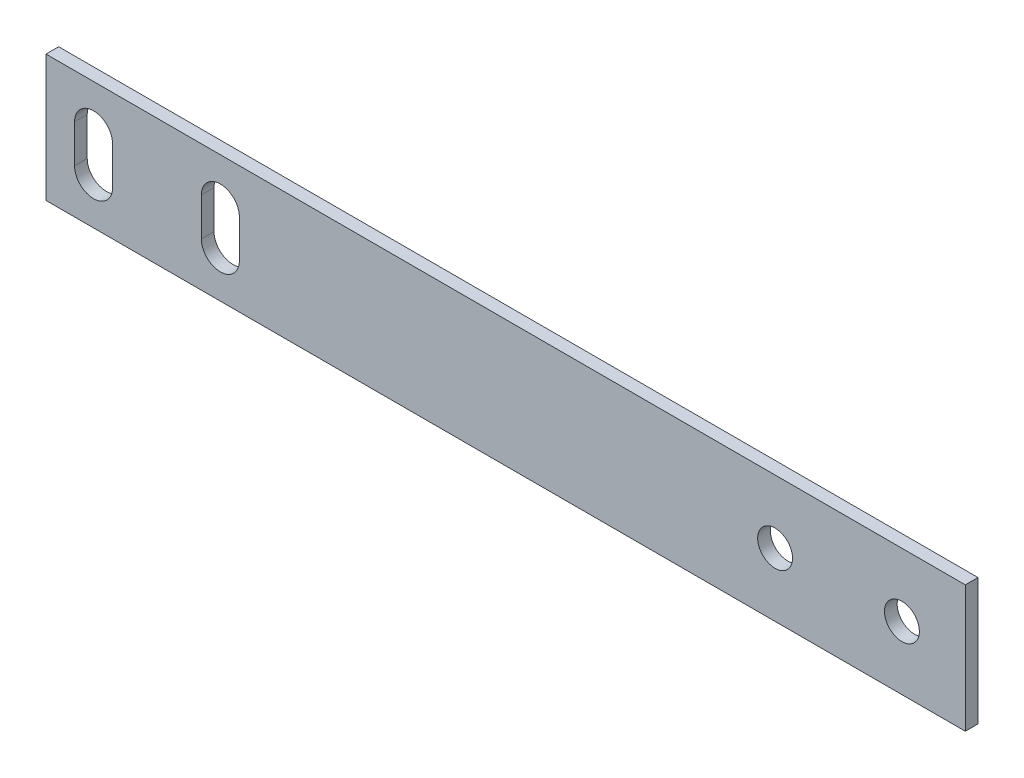
ISO-10303-21;
HEADER;
FILE_DESCRIPTION(('STEP AP214'),'2;1');
FILE_NAME('part.step','',(''),(''),'','','');
FILE_SCHEMA(('AUTOMOTIVE_DESIGN { 1 0 10303 214 1 1 1 1 }'));
ENDSEC;
DATA;
#1=APPLICATION_CONTEXT('core data for automotive mechanical design processes');
#2=APPLICATION_PROTOCOL_DEFINITION('international standard','automotive_design',2000,#1);
#3=PRODUCT_CONTEXT('',#1,'mechanical');
#4=PRODUCT('Part','Part','',(#3));
#5=PRODUCT_RELATED_PRODUCT_CATEGORY('part','',(#4));
#6=PRODUCT_DEFINITION_FORMATION('','',#4);
#7=PRODUCT_DEFINITION_CONTEXT('part definition',#1,'design');
#8=PRODUCT_DEFINITION('design','',#6,#7);
#9=PRODUCT_DEFINITION_SHAPE('','',#8);
#10=(LENGTH_UNIT() NAMED_UNIT(*) SI_UNIT(.MILLI.,.METRE.));
#11=(NAMED_UNIT(*) PLANE_ANGLE_UNIT() SI_UNIT($,.RADIAN.));
#12=(NAMED_UNIT(*) SI_UNIT($,.STERADIAN.) SOLID_ANGLE_UNIT());
#13=UNCERTAINTY_MEASURE_WITH_UNIT(LENGTH_MEASURE(1.E-05),#10,'distance_accuracy_value','');
#14=(GEOMETRIC_REPRESENTATION_CONTEXT(3) GLOBAL_UNCERTAINTY_ASSIGNED_CONTEXT((#13)) GLOBAL_UNIT_ASSIGNED_CONTEXT((#10,
#11,#12)) REPRESENTATION_CONTEXT('',''));
#15=CARTESIAN_POINT('',(0.,0.,0.));
#16=DIRECTION('',(0.,0.,1.));
#17=DIRECTION('',(1.,0.,0.));
#18=AXIS2_PLACEMENT_3D('',#15,#16,#17);
#19=CARTESIAN_POINT('',(0.,0.,2.));
#20=DIRECTION('',(0.,0.,-1.));
#21=DIRECTION('',(-1.,0.,0.));
#22=AXIS2_PLACEMENT_3D('',#19,#20,#21);
#23=PLANE('',#22);
#24=CARTESIAN_POINT('',(-65.,-3.,2.));
#25=DIRECTION('',(0.,0.,1.));
#26=DIRECTION('',(1.,0.,0.));
#27=AXIS2_PLACEMENT_3D('',#24,#25,#26);
#28=CIRCLE('',#27,3.);
#29=CARTESIAN_POINT('',(-68.,-3.,2.));
#30=VERTEX_POINT('',#29);
#31=CARTESIAN_POINT('',(-62.,-3.,2.));
#32=VERTEX_POINT('',#31);
#33=EDGE_CURVE('E177',#30,#32,#28,.T.);
#34=ORIENTED_EDGE('',*,*,#33,.F.);
#35=DIRECTION('',(0.,-1.,0.));
#36=VECTOR('',#35,1.);
#37=CARTESIAN_POINT('',(-68.,-3.,2.));
#38=LINE('',#37,#36);
#39=CARTESIAN_POINT('',(-68.,3.,2.));
#40=VERTEX_POINT('',#39);
#41=EDGE_CURVE('E188',#40,#30,#38,.T.);
#42=ORIENTED_EDGE('',*,*,#41,.F.);
#43=CARTESIAN_POINT('',(-65.,3.,2.));
#44=DIRECTION('',(0.,0.,1.));
#45=DIRECTION('',(1.,0.,0.));
#46=AXIS2_PLACEMENT_3D('',#43,#44,#45);
#47=CIRCLE('',#46,3.);
#48=CARTESIAN_POINT('',(-62.,3.,2.));
#49=VERTEX_POINT('',#48);
#50=EDGE_CURVE('E184',#49,#40,#47,.T.);
#51=ORIENTED_EDGE('',*,*,#50,.F.);
#52=DIRECTION('',(0.,1.,0.));
#53=VECTOR('',#52,1.);
#54=CARTESIAN_POINT('',(-62.,-3.,2.));
#55=LINE('',#54,#53);
#56=EDGE_CURVE('E180',#32,#49,#55,.T.);
#57=ORIENTED_EDGE('',*,*,#56,.F.);
#58=EDGE_LOOP('',(#34,#42,#51,#57));
#59=FACE_BOUND('',#58,.T.);
#60=DIRECTION('',(0.,-1.,0.));
#61=VECTOR('',#60,1.);
#62=CARTESIAN_POINT('',(-72.5,9.99999999999999,2.));
#63=LINE('',#62,#61);
#64=CARTESIAN_POINT('',(-72.5,9.99999999999999,2.));
#65=VERTEX_POINT('',#64);
#66=CARTESIAN_POINT('',(-72.5,-10.,2.));
#67=VERTEX_POINT('',#66);
#68=EDGE_CURVE('E236',#65,#67,#63,.T.);
#69=ORIENTED_EDGE('',*,*,#68,.T.);
#70=DIRECTION('',(1.,0.,0.));
#71=VECTOR('',#70,1.);
#72=CARTESIAN_POINT('',(72.5,-9.99999999999999,2.));
#73=LINE('',#72,#71);
#74=CARTESIAN_POINT('',(72.5,-9.99999999999999,2.));
#75=VERTEX_POINT('',#74);
#76=EDGE_CURVE('E240',#67,#75,#73,.T.);
#77=ORIENTED_EDGE('',*,*,#76,.T.);
#78=DIRECTION('',(0.,1.,0.));
#79=VECTOR('',#78,1.);
#80=CARTESIAN_POINT('',(72.5,10.,2.));
#81=LINE('',#80,#79);
#82=CARTESIAN_POINT('',(72.5,10.,2.));
#83=VERTEX_POINT('',#82);
#84=EDGE_CURVE('E244',#75,#83,#81,.T.);
#85=ORIENTED_EDGE('',*,*,#84,.T.);
#86=DIRECTION('',(-1.,0.,0.));
#87=VECTOR('',#86,1.);
#88=CARTESIAN_POINT('',(72.5,10.,2.));
#89=LINE('',#88,#87);
#90=EDGE_CURVE('E247',#83,#65,#89,.T.);
#91=ORIENTED_EDGE('',*,*,#90,.T.);
#92=EDGE_LOOP('',(#69,#77,#85,#91));
#93=FACE_BOUND('',#92,.T.);
#94=CARTESIAN_POINT('',(62.5,0.,2.));
#95=DIRECTION('',(0.,0.,1.));
#96=DIRECTION('',(1.,0.,0.));
#97=AXIS2_PLACEMENT_3D('',#94,#95,#96);
#98=CIRCLE('',#97,2.75000000000001);
#99=CARTESIAN_POINT('',(65.25,0.,2.));
#100=VERTEX_POINT('',#99);
#101=EDGE_CURVE('E228',#100,#100,#98,.T.);
#102=ORIENTED_EDGE('',*,*,#101,.F.);
#103=EDGE_LOOP('',(#102));
#104=FACE_BOUND('',#103,.T.);
#105=CARTESIAN_POINT('',(42.5,0.,2.));
#106=DIRECTION('',(0.,0.,1.));
#107=DIRECTION('',(1.,0.,0.));
#108=AXIS2_PLACEMENT_3D('',#105,#106,#107);
#109=CIRCLE('',#108,2.75);
#110=CARTESIAN_POINT('',(45.25,0.,2.));
#111=VERTEX_POINT('',#110);
#112=EDGE_CURVE('E220',#111,#111,#109,.T.);
#113=ORIENTED_EDGE('',*,*,#112,.F.);
#114=EDGE_LOOP('',(#113));
#115=FACE_BOUND('',#114,.T.);
#116=CARTESIAN_POINT('',(-45.,-3.,2.));
#117=DIRECTION('',(0.,0.,1.));
#118=DIRECTION('',(1.,0.,0.));
#119=AXIS2_PLACEMENT_3D('',#116,#117,#118);
#120=CIRCLE('',#119,3.);
#121=CARTESIAN_POINT('',(-48.,-3.,2.));
#122=VERTEX_POINT('',#121);
#123=CARTESIAN_POINT('',(-42.,-3.,2.));
#124=VERTEX_POINT('',#123);
#125=EDGE_CURVE('E129',#122,#124,#120,.T.);
#126=ORIENTED_EDGE('',*,*,#125,.F.);
#127=DIRECTION('',(0.,-1.,0.));
#128=VECTOR('',#127,1.);
#129=CARTESIAN_POINT('',(-48.,-3.,2.));
#130=LINE('',#129,#128);
#131=CARTESIAN_POINT('',(-48.,3.,2.));
#132=VERTEX_POINT('',#131);
#133=EDGE_CURVE('E155',#132,#122,#130,.T.);
#134=ORIENTED_EDGE('',*,*,#133,.F.);
#135=CARTESIAN_POINT('',(-45.,3.,2.));
#136=DIRECTION('',(0.,0.,1.));
#137=DIRECTION('',(1.,0.,0.));
#138=AXIS2_PLACEMENT_3D('',#135,#136,#137);
#139=CIRCLE('',#138,3.);
#140=CARTESIAN_POINT('',(-42.,3.,2.));
#141=VERTEX_POINT('',#140);
#142=EDGE_CURVE('E151',#141,#132,#139,.T.);
#143=ORIENTED_EDGE('',*,*,#142,.F.);
#144=DIRECTION('',(0.,1.,0.));
#145=VECTOR('',#144,1.);
#146=CARTESIAN_POINT('',(-42.,-3.,2.));
#147=LINE('',#146,#145);
#148=EDGE_CURVE('E138',#124,#141,#147,.T.);
#149=ORIENTED_EDGE('',*,*,#148,.F.);
#150=EDGE_LOOP('',(#126,#134,#143,#149));
#151=FACE_BOUND('',#150,.T.);
#152=ADVANCED_FACE('F39',(#59,#93,#104,#115,#151),#23,.F.);
#153=CARTESIAN_POINT('',(0.,0.,0.));
#154=DIRECTION('',(0.,0.,-1.));
#155=DIRECTION('',(-1.,0.,0.));
#156=AXIS2_PLACEMENT_3D('',#153,#154,#155);
#157=PLANE('',#156);
#158=CARTESIAN_POINT('',(62.5,0.,0.));
#159=DIRECTION('',(0.,0.,1.));
#160=DIRECTION('',(1.,0.,0.));
#161=AXIS2_PLACEMENT_3D('',#158,#159,#160);
#162=CIRCLE('',#161,2.75000000000001);
#163=CARTESIAN_POINT('',(65.25,0.,0.));
#164=VERTEX_POINT('',#163);
#165=EDGE_CURVE('E224',#164,#164,#162,.T.);
#166=ORIENTED_EDGE('',*,*,#165,.T.);
#167=EDGE_LOOP('',(#166));
#168=FACE_BOUND('',#167,.T.);
#169=DIRECTION('',(0.,-1.,0.));
#170=VECTOR('',#169,1.);
#171=CARTESIAN_POINT('',(-72.5,9.99999999999999,0.));
#172=LINE('',#171,#170);
#173=CARTESIAN_POINT('',(-72.5,9.99999999999999,0.));
#174=VERTEX_POINT('',#173);
#175=CARTESIAN_POINT('',(-72.5,-10.,0.));
#176=VERTEX_POINT('',#175);
#177=EDGE_CURVE('E232',#174,#176,#172,.T.);
#178=ORIENTED_EDGE('',*,*,#177,.F.);
#179=DIRECTION('',(-1.,0.,0.));
#180=VECTOR('',#179,1.);
#181=CARTESIAN_POINT('',(72.5,10.,0.));
#182=LINE('',#181,#180);
#183=CARTESIAN_POINT('',(72.5,10.,0.));
#184=VERTEX_POINT('',#183);
#185=EDGE_CURVE('E241',#184,#174,#182,.T.);
#186=ORIENTED_EDGE('',*,*,#185,.F.);
#187=DIRECTION('',(0.,1.,0.));
#188=VECTOR('',#187,1.);
#189=CARTESIAN_POINT('',(72.5,10.,0.));
#190=LINE('',#189,#188);
#191=CARTESIAN_POINT('',(72.5,-9.99999999999999,0.));
#192=VERTEX_POINT('',#191);
#193=EDGE_CURVE('E257',#192,#184,#190,.T.);
#194=ORIENTED_EDGE('',*,*,#193,.F.);
#195=DIRECTION('',(1.,0.,0.));
#196=VECTOR('',#195,1.);
#197=CARTESIAN_POINT('',(72.5,-9.99999999999999,0.));
#198=LINE('',#197,#196);
#199=EDGE_CURVE('E254',#176,#192,#198,.T.);
#200=ORIENTED_EDGE('',*,*,#199,.F.);
#201=EDGE_LOOP('',(#178,#186,#194,#200));
#202=FACE_BOUND('',#201,.T.);
#203=CARTESIAN_POINT('',(42.5,0.,0.));
#204=DIRECTION('',(0.,0.,1.));
#205=DIRECTION('',(1.,0.,0.));
#206=AXIS2_PLACEMENT_3D('',#203,#204,#205);
#207=CIRCLE('',#206,2.75);
#208=CARTESIAN_POINT('',(45.25,0.,0.));
#209=VERTEX_POINT('',#208);
#210=EDGE_CURVE('E219',#209,#209,#207,.T.);
#211=ORIENTED_EDGE('',*,*,#210,.T.);
#212=EDGE_LOOP('',(#211));
#213=FACE_BOUND('',#212,.T.);
#214=DIRECTION('',(0.,-1.,0.));
#215=VECTOR('',#214,1.);
#216=CARTESIAN_POINT('',(-68.,-3.,0.));
#217=LINE('',#216,#215);
#218=CARTESIAN_POINT('',(-68.,3.,0.));
#219=VERTEX_POINT('',#218);
#220=CARTESIAN_POINT('',(-68.,-3.,0.));
#221=VERTEX_POINT('',#220);
#222=EDGE_CURVE('E181',#219,#221,#217,.T.);
#223=ORIENTED_EDGE('',*,*,#222,.T.);
#224=CARTESIAN_POINT('',(-65.,-3.,0.));
#225=DIRECTION('',(0.,0.,1.));
#226=DIRECTION('',(1.,0.,0.));
#227=AXIS2_PLACEMENT_3D('',#224,#225,#226);
#228=CIRCLE('',#227,3.);
#229=CARTESIAN_POINT('',(-62.,-3.,0.));
#230=VERTEX_POINT('',#229);
#231=EDGE_CURVE('E147',#221,#230,#228,.T.);
#232=ORIENTED_EDGE('',*,*,#231,.T.);
#233=DIRECTION('',(0.,1.,0.));
#234=VECTOR('',#233,1.);
#235=CARTESIAN_POINT('',(-62.,-3.,0.));
#236=LINE('',#235,#234);
#237=CARTESIAN_POINT('',(-62.,3.,0.));
#238=VERTEX_POINT('',#237);
#239=EDGE_CURVE('E195',#230,#238,#236,.T.);
#240=ORIENTED_EDGE('',*,*,#239,.T.);
#241=CARTESIAN_POINT('',(-65.,3.,0.));
#242=DIRECTION('',(0.,0.,1.));
#243=DIRECTION('',(1.,0.,0.));
#244=AXIS2_PLACEMENT_3D('',#241,#242,#243);
#245=CIRCLE('',#244,3.);
#246=EDGE_CURVE('E199',#238,#219,#245,.T.);
#247=ORIENTED_EDGE('',*,*,#246,.T.);
#248=EDGE_LOOP('',(#223,#232,#240,#247));
#249=FACE_BOUND('',#248,.T.);
#250=DIRECTION('',(0.,-1.,0.));
#251=VECTOR('',#250,1.);
#252=CARTESIAN_POINT('',(-48.,-3.,0.));
#253=LINE('',#252,#251);
#254=CARTESIAN_POINT('',(-48.,3.,0.));
#255=VERTEX_POINT('',#254);
#256=CARTESIAN_POINT('',(-48.,-3.,0.));
#257=VERTEX_POINT('',#256);
#258=EDGE_CURVE('E139',#255,#257,#253,.T.);
#259=ORIENTED_EDGE('',*,*,#258,.T.);
#260=CARTESIAN_POINT('',(-45.,-3.,0.));
#261=DIRECTION('',(0.,0.,1.));
#262=DIRECTION('',(1.,0.,0.));
#263=AXIS2_PLACEMENT_3D('',#260,#261,#262);
#264=CIRCLE('',#263,3.);
#265=CARTESIAN_POINT('',(-42.,-3.,0.));
#266=VERTEX_POINT('',#265);
#267=EDGE_CURVE('E63',#257,#266,#264,.T.);
#268=ORIENTED_EDGE('',*,*,#267,.T.);
#269=DIRECTION('',(0.,1.,0.));
#270=VECTOR('',#269,1.);
#271=CARTESIAN_POINT('',(-42.,-3.,0.));
#272=LINE('',#271,#270);
#273=CARTESIAN_POINT('',(-42.,3.,0.));
#274=VERTEX_POINT('',#273);
#275=EDGE_CURVE('E145',#266,#274,#272,.T.);
#276=ORIENTED_EDGE('',*,*,#275,.T.);
#277=CARTESIAN_POINT('',(-45.,3.,0.));
#278=DIRECTION('',(0.,0.,1.));
#279=DIRECTION('',(1.,0.,0.));
#280=AXIS2_PLACEMENT_3D('',#277,#278,#279);
#281=CIRCLE('',#280,3.);
#282=EDGE_CURVE('E164',#274,#255,#281,.T.);
#283=ORIENTED_EDGE('',*,*,#282,.T.);
#284=EDGE_LOOP('',(#259,#268,#276,#283));
#285=FACE_BOUND('',#284,.T.);
#286=ADVANCED_FACE('F280',(#168,#202,#213,#249,#285),#157,.T.);
#287=CARTESIAN_POINT('',(-72.5,9.99999999999999,2.));
#288=DIRECTION('',(1.,0.,0.));
#289=DIRECTION('',(0.,0.,-1.));
#290=AXIS2_PLACEMENT_3D('',#287,#288,#289);
#291=PLANE('',#290);
#292=ORIENTED_EDGE('',*,*,#177,.T.);
#293=DIRECTION('',(0.,0.,-1.));
#294=VECTOR('',#293,1.);
#295=CARTESIAN_POINT('',(-72.5,-10.,2.));
#296=LINE('',#295,#294);
#297=EDGE_CURVE('E11',#67,#176,#296,.T.);
#298=ORIENTED_EDGE('',*,*,#297,.F.);
#299=ORIENTED_EDGE('',*,*,#68,.F.);
#300=DIRECTION('',(0.,0.,-1.));
#301=VECTOR('',#300,1.);
#302=CARTESIAN_POINT('',(-72.5,9.99999999999999,2.));
#303=LINE('',#302,#301);
#304=EDGE_CURVE('E250',#65,#174,#303,.T.);
#305=ORIENTED_EDGE('',*,*,#304,.T.);
#306=EDGE_LOOP('',(#292,#298,#299,#305));
#307=FACE_BOUND('',#306,.T.);
#308=ADVANCED_FACE('F41',(#307),#291,.F.);
#309=CARTESIAN_POINT('',(72.5,-9.99999999999999,2.));
#310=DIRECTION('',(0.,1.,0.));
#311=DIRECTION('',(-1.,0.,0.));
#312=AXIS2_PLACEMENT_3D('',#309,#310,#311);
#313=PLANE('',#312);
#314=ORIENTED_EDGE('',*,*,#199,.T.);
#315=DIRECTION('',(0.,0.,-1.));
#316=VECTOR('',#315,1.);
#317=CARTESIAN_POINT('',(72.5,-9.99999999999999,2.));
#318=LINE('',#317,#316);
#319=EDGE_CURVE('E48',#75,#192,#318,.T.);
#320=ORIENTED_EDGE('',*,*,#319,.F.);
#321=ORIENTED_EDGE('',*,*,#76,.F.);
#322=ORIENTED_EDGE('',*,*,#297,.T.);
#323=EDGE_LOOP('',(#314,#320,#321,#322));
#324=FACE_BOUND('',#323,.T.);
#325=ADVANCED_FACE('F291',(#324),#313,.F.);
#326=CARTESIAN_POINT('',(72.5,10.,2.));
#327=DIRECTION('',(-1.,0.,0.));
#328=DIRECTION('',(0.,0.,1.));
#329=AXIS2_PLACEMENT_3D('',#326,#327,#328);
#330=PLANE('',#329);
#331=ORIENTED_EDGE('',*,*,#193,.T.);
#332=DIRECTION('',(0.,0.,-1.));
#333=VECTOR('',#332,1.);
#334=CARTESIAN_POINT('',(72.5,10.,2.));
#335=LINE('',#334,#333);
#336=EDGE_CURVE('E265',#83,#184,#335,.T.);
#337=ORIENTED_EDGE('',*,*,#336,.F.);
#338=ORIENTED_EDGE('',*,*,#84,.F.);
#339=ORIENTED_EDGE('',*,*,#319,.T.);
#340=EDGE_LOOP('',(#331,#337,#338,#339));
#341=FACE_BOUND('',#340,.T.);
#342=ADVANCED_FACE('F274',(#341),#330,.F.);
#343=CARTESIAN_POINT('',(72.5,10.,2.));
#344=DIRECTION('',(0.,-1.,0.));
#345=DIRECTION('',(1.,0.,0.));
#346=AXIS2_PLACEMENT_3D('',#343,#344,#345);
#347=PLANE('',#346);
#348=ORIENTED_EDGE('',*,*,#185,.T.);
#349=ORIENTED_EDGE('',*,*,#304,.F.);
#350=ORIENTED_EDGE('',*,*,#90,.F.);
#351=ORIENTED_EDGE('',*,*,#336,.T.);
#352=EDGE_LOOP('',(#348,#349,#350,#351));
#353=FACE_BOUND('',#352,.T.);
#354=ADVANCED_FACE('F284',(#353),#347,.F.);
#355=CARTESIAN_POINT('',(62.5,0.,2.));
#356=DIRECTION('',(0.,0.,-1.));
#357=DIRECTION('',(-1.,0.,0.));
#358=AXIS2_PLACEMENT_3D('',#355,#356,#357);
#359=CYLINDRICAL_SURFACE('',#358,2.75000000000001);
#360=ORIENTED_EDGE('',*,*,#101,.T.);
#361=EDGE_LOOP('',(#360));
#362=FACE_BOUND('',#361,.T.);
#363=ORIENTED_EDGE('',*,*,#165,.F.);
#364=EDGE_LOOP('',(#363));
#365=FACE_BOUND('',#364,.T.);
#366=ADVANCED_FACE('F308',(#362,#365),#359,.F.);
#367=CARTESIAN_POINT('',(42.5,0.,2.));
#368=DIRECTION('',(0.,0.,-1.));
#369=DIRECTION('',(-1.,0.,0.));
#370=AXIS2_PLACEMENT_3D('',#367,#368,#369);
#371=CYLINDRICAL_SURFACE('',#370,2.75);
#372=ORIENTED_EDGE('',*,*,#112,.T.);
#373=EDGE_LOOP('',(#372));
#374=FACE_BOUND('',#373,.T.);
#375=ORIENTED_EDGE('',*,*,#210,.F.);
#376=EDGE_LOOP('',(#375));
#377=FACE_BOUND('',#376,.T.);
#378=ADVANCED_FACE('F315',(#374,#377),#371,.F.);
#379=CARTESIAN_POINT('',(-65.,-3.,2.));
#380=DIRECTION('',(0.,0.,-1.));
#381=DIRECTION('',(-1.,0.,0.));
#382=AXIS2_PLACEMENT_3D('',#379,#380,#381);
#383=CYLINDRICAL_SURFACE('',#382,3.);
#384=ORIENTED_EDGE('',*,*,#231,.F.);
#385=DIRECTION('',(0.,0.,-1.));
#386=VECTOR('',#385,1.);
#387=CARTESIAN_POINT('',(-68.,-3.,2.));
#388=LINE('',#387,#386);
#389=EDGE_CURVE('E191',#30,#221,#388,.T.);
#390=ORIENTED_EDGE('',*,*,#389,.F.);
#391=ORIENTED_EDGE('',*,*,#33,.T.);
#392=DIRECTION('',(0.,0.,-1.));
#393=VECTOR('',#392,1.);
#394=CARTESIAN_POINT('',(-62.,-3.,2.));
#395=LINE('',#394,#393);
#396=EDGE_CURVE('E215',#32,#230,#395,.T.);
#397=ORIENTED_EDGE('',*,*,#396,.T.);
#398=EDGE_LOOP('',(#384,#390,#391,#397));
#399=FACE_BOUND('',#398,.T.);
#400=ADVANCED_FACE('F320',(#399),#383,.F.);
#401=CARTESIAN_POINT('',(-62.,-3.,2.));
#402=DIRECTION('',(-1.,0.,0.));
#403=DIRECTION('',(0.,0.,1.));
#404=AXIS2_PLACEMENT_3D('',#401,#402,#403);
#405=PLANE('',#404);
#406=ORIENTED_EDGE('',*,*,#239,.F.);
#407=ORIENTED_EDGE('',*,*,#396,.F.);
#408=ORIENTED_EDGE('',*,*,#56,.T.);
#409=DIRECTION('',(0.,0.,-1.));
#410=VECTOR('',#409,1.);
#411=CARTESIAN_POINT('',(-62.,3.,2.));
#412=LINE('',#411,#410);
#413=EDGE_CURVE('E212',#49,#238,#412,.T.);
#414=ORIENTED_EDGE('',*,*,#413,.T.);
#415=EDGE_LOOP('',(#406,#407,#408,#414));
#416=FACE_BOUND('',#415,.T.);
#417=ADVANCED_FACE('F354',(#416),#405,.T.);
#418=CARTESIAN_POINT('',(-65.,3.,2.));
#419=DIRECTION('',(0.,0.,-1.));
#420=DIRECTION('',(-1.,0.,0.));
#421=AXIS2_PLACEMENT_3D('',#418,#419,#420);
#422=CYLINDRICAL_SURFACE('',#421,3.);
#423=ORIENTED_EDGE('',*,*,#246,.F.);
#424=ORIENTED_EDGE('',*,*,#413,.F.);
#425=ORIENTED_EDGE('',*,*,#50,.T.);
#426=DIRECTION('',(0.,0.,-1.));
#427=VECTOR('',#426,1.);
#428=CARTESIAN_POINT('',(-68.,3.,2.));
#429=LINE('',#428,#427);
#430=EDGE_CURVE('E209',#40,#219,#429,.T.);
#431=ORIENTED_EDGE('',*,*,#430,.T.);
#432=EDGE_LOOP('',(#423,#424,#425,#431));
#433=FACE_BOUND('',#432,.T.);
#434=ADVANCED_FACE('F350',(#433),#422,.F.);
#435=CARTESIAN_POINT('',(-68.,-3.,2.));
#436=DIRECTION('',(1.,0.,0.));
#437=DIRECTION('',(0.,0.,-1.));
#438=AXIS2_PLACEMENT_3D('',#435,#436,#437);
#439=PLANE('',#438);
#440=ORIENTED_EDGE('',*,*,#222,.F.);
#441=ORIENTED_EDGE('',*,*,#430,.F.);
#442=ORIENTED_EDGE('',*,*,#41,.T.);
#443=ORIENTED_EDGE('',*,*,#389,.T.);
#444=EDGE_LOOP('',(#440,#441,#442,#443));
#445=FACE_BOUND('',#444,.T.);
#446=ADVANCED_FACE('F347',(#445),#439,.T.);
#447=CARTESIAN_POINT('',(-45.,-3.,2.));
#448=DIRECTION('',(0.,0.,-1.));
#449=DIRECTION('',(-1.,0.,0.));
#450=AXIS2_PLACEMENT_3D('',#447,#448,#449);
#451=CYLINDRICAL_SURFACE('',#450,3.);
#452=ORIENTED_EDGE('',*,*,#267,.F.);
#453=DIRECTION('',(0.,0.,-1.));
#454=VECTOR('',#453,1.);
#455=CARTESIAN_POINT('',(-48.,-3.,2.));
#456=LINE('',#455,#454);
#457=EDGE_CURVE('E133',#122,#257,#456,.T.);
#458=ORIENTED_EDGE('',*,*,#457,.F.);
#459=ORIENTED_EDGE('',*,*,#125,.T.);
#460=DIRECTION('',(0.,0.,-1.));
#461=VECTOR('',#460,1.);
#462=CARTESIAN_POINT('',(-42.,-3.,2.));
#463=LINE('',#462,#461);
#464=EDGE_CURVE('E132',#124,#266,#463,.T.);
#465=ORIENTED_EDGE('',*,*,#464,.T.);
#466=EDGE_LOOP('',(#452,#458,#459,#465));
#467=FACE_BOUND('',#466,.T.);
#468=ADVANCED_FACE('F131',(#467),#451,.F.);
#469=CARTESIAN_POINT('',(-42.,-3.,2.));
#470=DIRECTION('',(-1.,0.,0.));
#471=DIRECTION('',(0.,0.,1.));
#472=AXIS2_PLACEMENT_3D('',#469,#470,#471);
#473=PLANE('',#472);
#474=ORIENTED_EDGE('',*,*,#275,.F.);
#475=ORIENTED_EDGE('',*,*,#464,.F.);
#476=ORIENTED_EDGE('',*,*,#148,.T.);
#477=DIRECTION('',(0.,0.,-1.));
#478=VECTOR('',#477,1.);
#479=CARTESIAN_POINT('',(-42.,3.,2.));
#480=LINE('',#479,#478);
#481=EDGE_CURVE('E148',#141,#274,#480,.T.);
#482=ORIENTED_EDGE('',*,*,#481,.T.);
#483=EDGE_LOOP('',(#474,#475,#476,#482));
#484=FACE_BOUND('',#483,.T.);
#485=ADVANCED_FACE('F142',(#484),#473,.T.);
#486=CARTESIAN_POINT('',(-45.,3.,2.));
#487=DIRECTION('',(0.,0.,-1.));
#488=DIRECTION('',(-1.,0.,0.));
#489=AXIS2_PLACEMENT_3D('',#486,#487,#488);
#490=CYLINDRICAL_SURFACE('',#489,3.);
#491=ORIENTED_EDGE('',*,*,#282,.F.);
#492=ORIENTED_EDGE('',*,*,#481,.F.);
#493=ORIENTED_EDGE('',*,*,#142,.T.);
#494=DIRECTION('',(0.,0.,-1.));
#495=VECTOR('',#494,1.);
#496=CARTESIAN_POINT('',(-48.,3.,2.));
#497=LINE('',#496,#495);
#498=EDGE_CURVE('E55',#132,#255,#497,.T.);
#499=ORIENTED_EDGE('',*,*,#498,.T.);
#500=EDGE_LOOP('',(#491,#492,#493,#499));
#501=FACE_BOUND('',#500,.T.);
#502=ADVANCED_FACE('F335',(#501),#490,.F.);
#503=CARTESIAN_POINT('',(-48.,-3.,2.));
#504=DIRECTION('',(1.,0.,0.));
#505=DIRECTION('',(0.,0.,-1.));
#506=AXIS2_PLACEMENT_3D('',#503,#504,#505);
#507=PLANE('',#506);
#508=ORIENTED_EDGE('',*,*,#258,.F.);
#509=ORIENTED_EDGE('',*,*,#498,.F.);
#510=ORIENTED_EDGE('',*,*,#133,.T.);
#511=ORIENTED_EDGE('',*,*,#457,.T.);
#512=EDGE_LOOP('',(#508,#509,#510,#511));
#513=FACE_BOUND('',#512,.T.);
#514=ADVANCED_FACE('F333',(#513),#507,.T.);
#515=CLOSED_SHELL('',(#152,#286,#308,#325,#342,#354,#366,#378,#400,#417,#434,#446,#468,#485,
#502,#514));
#516=MANIFOLD_SOLID_BREP('B2',#515);
#517=ADVANCED_BREP_SHAPE_REPRESENTATION('',(#18,#516),#14);
#518=SHAPE_DEFINITION_REPRESENTATION(#9,#517);
ENDSEC;
END-ISO-10303-21;
